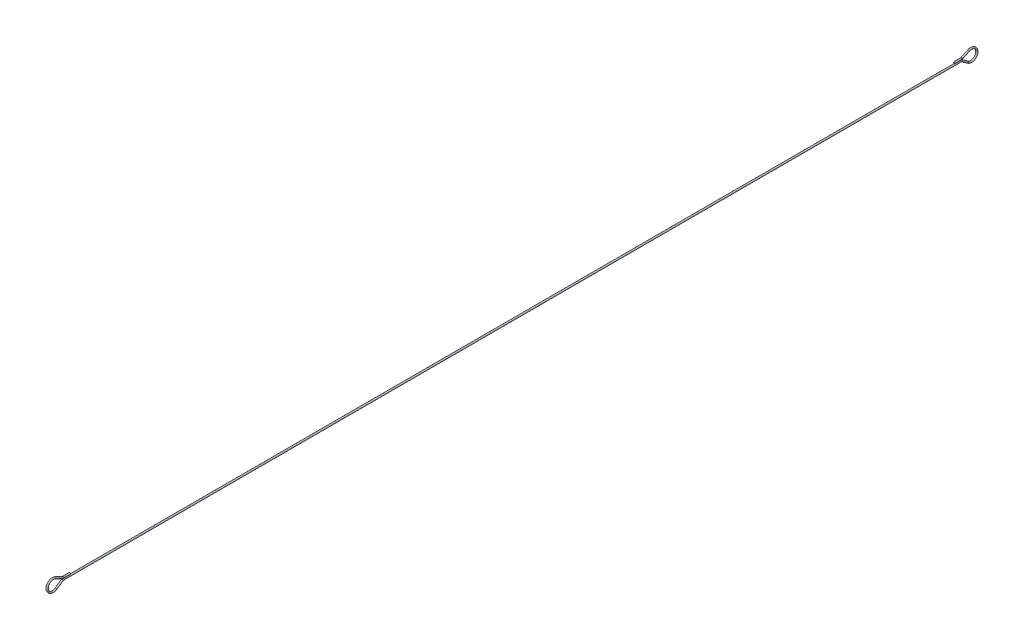
ISO-10303-21;
HEADER;
FILE_DESCRIPTION(('STEP AP214'),'2;1');
FILE_NAME('part.step','',(''),(''),'','','');
FILE_SCHEMA(('AUTOMOTIVE_DESIGN { 1 0 10303 214 1 1 1 1 }'));
ENDSEC;
DATA;
#1=APPLICATION_CONTEXT('core data for automotive mechanical design processes');
#2=APPLICATION_PROTOCOL_DEFINITION('international standard','automotive_design',2000,#1);
#3=PRODUCT_CONTEXT('',#1,'mechanical');
#4=PRODUCT('Part','Part','',(#3));
#5=PRODUCT_RELATED_PRODUCT_CATEGORY('part','',(#4));
#6=PRODUCT_DEFINITION_FORMATION('','',#4);
#7=PRODUCT_DEFINITION_CONTEXT('part definition',#1,'design');
#8=PRODUCT_DEFINITION('design','',#6,#7);
#9=PRODUCT_DEFINITION_SHAPE('','',#8);
#10=(LENGTH_UNIT() NAMED_UNIT(*) SI_UNIT(.MILLI.,.METRE.));
#11=(NAMED_UNIT(*) PLANE_ANGLE_UNIT() SI_UNIT($,.RADIAN.));
#12=(NAMED_UNIT(*) SI_UNIT($,.STERADIAN.) SOLID_ANGLE_UNIT());
#13=UNCERTAINTY_MEASURE_WITH_UNIT(LENGTH_MEASURE(1.E-05),#10,'distance_accuracy_value','');
#14=(GEOMETRIC_REPRESENTATION_CONTEXT(3) GLOBAL_UNCERTAINTY_ASSIGNED_CONTEXT((#13)) GLOBAL_UNIT_ASSIGNED_CONTEXT((#10,
#11,#12)) REPRESENTATION_CONTEXT('',''));
#15=CARTESIAN_POINT('',(0.,0.,0.));
#16=DIRECTION('',(0.,0.,1.));
#17=DIRECTION('',(1.,0.,0.));
#18=AXIS2_PLACEMENT_3D('',#15,#16,#17);
#19=CARTESIAN_POINT('',(0.,3.2,869.989079713668));
#20=DIRECTION('',(0.,0.,-1.));
#21=DIRECTION('',(1.,0.,0.));
#22=AXIS2_PLACEMENT_3D('',#19,#20,#21);
#23=PLANE('',#22);
#24=CARTESIAN_POINT('',(0.,3.2,869.989079713668));
#25=DIRECTION('',(0.,0.,-1.));
#26=DIRECTION('',(1.,0.,0.));
#27=AXIS2_PLACEMENT_3D('',#24,#25,#26);
#28=CIRCLE('',#27,1.5875);
#29=CARTESIAN_POINT('',(1.5875,3.2,869.989079713668));
#30=VERTEX_POINT('',#29);
#31=EDGE_CURVE('E10',#30,#30,#28,.T.);
#32=ORIENTED_EDGE('',*,*,#31,.T.);
#33=EDGE_LOOP('',(#32));
#34=FACE_BOUND('',#33,.T.);
#35=ADVANCED_FACE('F39',(#34),#23,.T.);
#36=CARTESIAN_POINT('',(0.,0.,0.));
#37=DIRECTION('',(0.,0.,1.));
#38=DIRECTION('',(0.,-1.,0.));
#39=AXIS2_PLACEMENT_3D('',#36,#37,#38);
#40=CYLINDRICAL_SURFACE('',#39,1.5875);
#41=CARTESIAN_POINT('',(0.,-1.44415729375069E-13,882.689079713668));
#42=DIRECTION('',(0.,0.,1.));
#43=DIRECTION('',(1.,0.,0.));
#44=AXIS2_PLACEMENT_3D('',#41,#42,#43);
#45=CIRCLE('',#44,1.5875);
#46=CARTESIAN_POINT('',(0.,1.58749999999987,882.689079713668));
#47=VERTEX_POINT('',#46);
#48=EDGE_CURVE('E70',#47,#47,#45,.T.);
#49=ORIENTED_EDGE('',*,*,#48,.F.);
#50=EDGE_LOOP('',(#49));
#51=FACE_BOUND('',#50,.T.);
#52=CARTESIAN_POINT('',(0.,-1.44415729375069E-13,-882.689079713668));
#53=DIRECTION('',(0.,0.,1.));
#54=DIRECTION('',(1.,0.,0.));
#55=AXIS2_PLACEMENT_3D('',#52,#53,#54);
#56=CIRCLE('',#55,1.5875);
#57=CARTESIAN_POINT('',(0.,1.58749999999987,-882.689079713668));
#58=VERTEX_POINT('',#57);
#59=EDGE_CURVE('E98',#58,#58,#56,.F.);
#60=ORIENTED_EDGE('',*,*,#59,.F.);
#61=EDGE_LOOP('',(#60));
#62=FACE_BOUND('',#61,.T.);
#63=ADVANCED_FACE('F105',(#51,#62),#40,.T.);
#64=CARTESIAN_POINT('',(0.,-3.17500000000003,882.689079713668));
#65=DIRECTION('',(1.,0.,0.));
#66=DIRECTION('',(0.,0.,-1.));
#67=AXIS2_PLACEMENT_3D('',#64,#65,#66);
#68=TOROIDAL_SURFACE('',#67,3.17499999999991,1.5875);
#69=CARTESIAN_POINT('',(0.,-0.567642289303452,884.500794583197));
#70=DIRECTION('',(0.,-0.57061885654441,0.821215026991074));
#71=DIRECTION('',(1.,0.,0.));
#72=AXIS2_PLACEMENT_3D('',#69,#70,#71);
#73=CIRCLE('',#72,1.5875);
#74=CARTESIAN_POINT('',(0.,0.736036566044864,885.406652017961));
#75=VERTEX_POINT('',#74);
#76=EDGE_CURVE('E66',#75,#75,#73,.T.);
#77=CARTESIAN_POINT('',(0.,-3.17500000000003,882.689079713668));
#78=DIRECTION('',(1.,0.,0.));
#79=DIRECTION('',(0.,0.,-1.));
#80=AXIS2_PLACEMENT_3D('',#77,#78,#79);
#81=CIRCLE('',#80,4.76249999999991);
#82=EDGE_CURVE('',#47,#75,#81,.T.);
#83=ORIENTED_EDGE('',*,*,#48,.T.);
#84=ORIENTED_EDGE('',*,*,#76,.F.);
#85=ORIENTED_EDGE('',*,*,#82,.T.);
#86=ORIENTED_EDGE('',*,*,#82,.F.);
#87=EDGE_LOOP('',(#83,#85,#84,#86));
#88=FACE_BOUND('',#87,.T.);
#89=ADVANCED_FACE('F107',(#88),#68,.T.);
#90=CARTESIAN_POINT('',(0.,-0.567642289303438,884.500794583197));
#91=DIRECTION('',(0.,-0.570618856544421,0.821215026991066));
#92=DIRECTION('',(0.,-0.821215026991067,-0.570618856544421));
#93=AXIS2_PLACEMENT_3D('',#90,#91,#92);
#94=CYLINDRICAL_SURFACE('',#93,1.5875);
#95=CARTESIAN_POINT('',(0.,-9.17594890499199,896.889573307686));
#96=DIRECTION('',(0.,-0.570618856544421,0.821215026991067));
#97=DIRECTION('',(1.,0.,0.));
#98=AXIS2_PLACEMENT_3D('',#95,#96,#97);
#99=CIRCLE('',#98,1.5875);
#100=CARTESIAN_POINT('',(0.,-10.4796277603403,895.983715872922));
#101=VERTEX_POINT('',#100);
#102=EDGE_CURVE('E62',#101,#101,#99,.T.);
#103=ORIENTED_EDGE('',*,*,#102,.F.);
#104=EDGE_LOOP('',(#103));
#105=FACE_BOUND('',#104,.T.);
#106=ORIENTED_EDGE('',*,*,#76,.T.);
#107=EDGE_LOOP('',(#106));
#108=FACE_BOUND('',#107,.T.);
#109=ADVANCED_FACE('F114',(#105,#108),#94,.T.);
#110=CARTESIAN_POINT('',(0.,0.,903.265454532195));
#111=DIRECTION('',(-1.,0.,0.));
#112=DIRECTION('',(0.,0.,1.));
#113=AXIS2_PLACEMENT_3D('',#110,#111,#112);
#114=TOROIDAL_SURFACE('',#113,11.1736251814736,1.5875);
#115=CARTESIAN_POINT('',(0.,10.1096495644325,898.506790288898));
#116=DIRECTION('',(0.,-0.425883647071573,-0.904777939141432));
#117=DIRECTION('',(1.,0.,0.));
#118=AXIS2_PLACEMENT_3D('',#115,#116,#117);
#119=CIRCLE('',#118,1.5875);
#120=CARTESIAN_POINT('',(0.,11.5459845428195,897.830699999172));
#121=VERTEX_POINT('',#120);
#122=EDGE_CURVE('E56',#121,#121,#119,.T.);
#123=CARTESIAN_POINT('',(0.,0.,903.265454532195));
#124=DIRECTION('',(-1.,0.,0.));
#125=DIRECTION('',(0.,0.,1.));
#126=AXIS2_PLACEMENT_3D('',#123,#124,#125);
#127=CIRCLE('',#126,12.7611251814736);
#128=EDGE_CURVE('',#101,#121,#127,.T.);
#129=ORIENTED_EDGE('',*,*,#102,.T.);
#130=ORIENTED_EDGE('',*,*,#122,.F.);
#131=ORIENTED_EDGE('',*,*,#128,.T.);
#132=ORIENTED_EDGE('',*,*,#128,.F.);
#133=EDGE_LOOP('',(#129,#131,#130,#132));
#134=FACE_BOUND('',#133,.T.);
#135=ADVANCED_FACE('F136',(#134),#114,.T.);
#136=CARTESIAN_POINT('',(0.,10.1096495644325,898.506790288898));
#137=DIRECTION('',(0.,-0.425883647071573,-0.904777939141432));
#138=DIRECTION('',(0.,0.904777939141432,-0.425883647071573));
#139=AXIS2_PLACEMENT_3D('',#136,#137,#138);
#140=CYLINDRICAL_SURFACE('',#139,1.5875);
#141=CARTESIAN_POINT('',(0.,3.68480577500471,884.857388713901));
#142=DIRECTION('',(0.,-0.425883647071573,-0.904777939141431));
#143=DIRECTION('',(1.,0.,0.));
#144=AXIS2_PLACEMENT_3D('',#141,#142,#143);
#145=CIRCLE('',#144,1.5875);
#146=CARTESIAN_POINT('',(0.,2.24847079661767,885.533479003627));
#147=VERTEX_POINT('',#146);
#148=EDGE_CURVE('E51',#147,#147,#145,.T.);
#149=ORIENTED_EDGE('',*,*,#148,.F.);
#150=EDGE_LOOP('',(#149));
#151=FACE_BOUND('',#150,.T.);
#152=ORIENTED_EDGE('',*,*,#122,.T.);
#153=EDGE_LOOP('',(#152));
#154=FACE_BOUND('',#153,.T.);
#155=ADVANCED_FACE('F130',(#151,#154),#140,.T.);
#156=CARTESIAN_POINT('',(0.,8.29131781683219,882.689079713668));
#157=DIRECTION('',(1.,0.,0.));
#158=DIRECTION('',(0.,0.,-1.));
#159=AXIS2_PLACEMENT_3D('',#156,#157,#158);
#160=TOROIDAL_SURFACE('',#159,5.09131781683217,1.5875);
#161=CARTESIAN_POINT('',(0.,3.20000000000002,882.689079713668));
#162=DIRECTION('',(0.,0.,-1.));
#163=DIRECTION('',(1.,0.,0.));
#164=AXIS2_PLACEMENT_3D('',#161,#162,#163);
#165=CIRCLE('',#164,1.5875);
#166=CARTESIAN_POINT('',(0.,1.61250000000002,882.689079713668));
#167=VERTEX_POINT('',#166);
#168=EDGE_CURVE('E46',#167,#167,#165,.T.);
#169=CARTESIAN_POINT('',(0.,8.29131781683219,882.689079713668));
#170=DIRECTION('',(1.,0.,0.));
#171=DIRECTION('',(0.,0.,-1.));
#172=AXIS2_PLACEMENT_3D('',#169,#170,#171);
#173=CIRCLE('',#172,6.67881781683217);
#174=EDGE_CURVE('',#147,#167,#173,.T.);
#175=ORIENTED_EDGE('',*,*,#148,.T.);
#176=ORIENTED_EDGE('',*,*,#168,.F.);
#177=ORIENTED_EDGE('',*,*,#174,.T.);
#178=ORIENTED_EDGE('',*,*,#174,.F.);
#179=EDGE_LOOP('',(#175,#177,#176,#178));
#180=FACE_BOUND('',#179,.T.);
#181=ADVANCED_FACE('F123',(#180),#160,.T.);
#182=CARTESIAN_POINT('',(0.,3.2,882.689079713668));
#183=DIRECTION('',(0.,0.,-1.));
#184=DIRECTION('',(-1.,0.,0.));
#185=AXIS2_PLACEMENT_3D('',#182,#183,#184);
#186=CYLINDRICAL_SURFACE('',#185,1.5875);
#187=ORIENTED_EDGE('',*,*,#31,.F.);
#188=EDGE_LOOP('',(#187));
#189=FACE_BOUND('',#188,.T.);
#190=ORIENTED_EDGE('',*,*,#168,.T.);
#191=EDGE_LOOP('',(#190));
#192=FACE_BOUND('',#191,.T.);
#193=ADVANCED_FACE('F120',(#189,#192),#186,.T.);
#194=CARTESIAN_POINT('',(0.,3.2,-869.989079713668));
#195=DIRECTION('',(0.,0.,1.));
#196=DIRECTION('',(1.,0.,0.));
#197=AXIS2_PLACEMENT_3D('',#194,#195,#196);
#198=PLANE('',#197);
#199=CARTESIAN_POINT('',(0.,3.2,-869.989079713668));
#200=DIRECTION('',(0.,0.,-1.));
#201=DIRECTION('',(1.,0.,0.));
#202=AXIS2_PLACEMENT_3D('',#199,#200,#201);
#203=CIRCLE('',#202,1.5875);
#204=CARTESIAN_POINT('',(1.5875,3.2,-869.989079713668));
#205=VERTEX_POINT('',#204);
#206=EDGE_CURVE('E74',#205,#205,#203,.F.);
#207=ORIENTED_EDGE('',*,*,#206,.T.);
#208=EDGE_LOOP('',(#207));
#209=FACE_BOUND('',#208,.T.);
#210=ADVANCED_FACE('F122',(#209),#198,.T.);
#211=CARTESIAN_POINT('',(0.,-3.17500000000003,-882.689079713668));
#212=DIRECTION('',(-1.,0.,0.));
#213=DIRECTION('',(0.,0.,1.));
#214=AXIS2_PLACEMENT_3D('',#211,#212,#213);
#215=TOROIDAL_SURFACE('',#214,3.17499999999991,1.5875);
#216=CARTESIAN_POINT('',(0.,-0.567642289303452,-884.500794583197));
#217=DIRECTION('',(0.,0.57061885654441,0.821215026991074));
#218=DIRECTION('',(1.,0.,0.));
#219=AXIS2_PLACEMENT_3D('',#216,#217,#218);
#220=CIRCLE('',#219,1.5875);
#221=CARTESIAN_POINT('',(0.,0.736036566044864,-885.406652017961));
#222=VERTEX_POINT('',#221);
#223=EDGE_CURVE('E94',#222,#222,#220,.F.);
#224=CARTESIAN_POINT('',(0.,-3.17500000000003,-882.689079713668));
#225=DIRECTION('',(-1.,0.,0.));
#226=DIRECTION('',(0.,0.,1.));
#227=AXIS2_PLACEMENT_3D('',#224,#225,#226);
#228=CIRCLE('',#227,4.76249999999991);
#229=EDGE_CURVE('',#58,#222,#228,.T.);
#230=ORIENTED_EDGE('',*,*,#59,.T.);
#231=ORIENTED_EDGE('',*,*,#223,.F.);
#232=ORIENTED_EDGE('',*,*,#229,.T.);
#233=ORIENTED_EDGE('',*,*,#229,.F.);
#234=EDGE_LOOP('',(#230,#232,#231,#233));
#235=FACE_BOUND('',#234,.T.);
#236=ADVANCED_FACE('F103',(#235),#215,.T.);
#237=CARTESIAN_POINT('',(0.,-0.567642289303438,-884.500794583197));
#238=DIRECTION('',(0.,-0.570618856544421,-0.821215026991066));
#239=DIRECTION('',(0.,0.821215026991067,-0.570618856544421));
#240=AXIS2_PLACEMENT_3D('',#237,#238,#239);
#241=CYLINDRICAL_SURFACE('',#240,1.5875);
#242=CARTESIAN_POINT('',(0.,-9.17594890499199,-896.889573307686));
#243=DIRECTION('',(0.,0.570618856544421,0.821215026991067));
#244=DIRECTION('',(1.,0.,0.));
#245=AXIS2_PLACEMENT_3D('',#242,#243,#244);
#246=CIRCLE('',#245,1.5875);
#247=CARTESIAN_POINT('',(0.,-10.4796277603403,-895.983715872922));
#248=VERTEX_POINT('',#247);
#249=EDGE_CURVE('E90',#248,#248,#246,.F.);
#250=ORIENTED_EDGE('',*,*,#249,.F.);
#251=EDGE_LOOP('',(#250));
#252=FACE_BOUND('',#251,.T.);
#253=ORIENTED_EDGE('',*,*,#223,.T.);
#254=EDGE_LOOP('',(#253));
#255=FACE_BOUND('',#254,.T.);
#256=ADVANCED_FACE('F188',(#252,#255),#241,.T.);
#257=CARTESIAN_POINT('',(0.,0.,-903.265454532195));
#258=DIRECTION('',(1.,0.,0.));
#259=DIRECTION('',(0.,0.,-1.));
#260=AXIS2_PLACEMENT_3D('',#257,#258,#259);
#261=TOROIDAL_SURFACE('',#260,11.1736251814736,1.5875);
#262=CARTESIAN_POINT('',(0.,10.1096495644325,-898.506790288898));
#263=DIRECTION('',(0.,0.425883647071573,-0.904777939141432));
#264=DIRECTION('',(1.,0.,0.));
#265=AXIS2_PLACEMENT_3D('',#262,#263,#264);
#266=CIRCLE('',#265,1.5875);
#267=CARTESIAN_POINT('',(0.,11.5459845428195,-897.830699999172));
#268=VERTEX_POINT('',#267);
#269=EDGE_CURVE('E86',#268,#268,#266,.F.);
#270=CARTESIAN_POINT('',(0.,0.,-903.265454532195));
#271=DIRECTION('',(1.,0.,0.));
#272=DIRECTION('',(0.,0.,-1.));
#273=AXIS2_PLACEMENT_3D('',#270,#271,#272);
#274=CIRCLE('',#273,12.7611251814736);
#275=EDGE_CURVE('',#248,#268,#274,.T.);
#276=ORIENTED_EDGE('',*,*,#249,.T.);
#277=ORIENTED_EDGE('',*,*,#269,.F.);
#278=ORIENTED_EDGE('',*,*,#275,.T.);
#279=ORIENTED_EDGE('',*,*,#275,.F.);
#280=EDGE_LOOP('',(#276,#278,#277,#279));
#281=FACE_BOUND('',#280,.T.);
#282=ADVANCED_FACE('F198',(#281),#261,.T.);
#283=CARTESIAN_POINT('',(0.,10.1096495644325,-898.506790288898));
#284=DIRECTION('',(0.,-0.425883647071573,0.904777939141432));
#285=DIRECTION('',(0.,-0.904777939141432,-0.425883647071573));
#286=AXIS2_PLACEMENT_3D('',#283,#284,#285);
#287=CYLINDRICAL_SURFACE('',#286,1.5875);
#288=CARTESIAN_POINT('',(0.,3.68480577500471,-884.857388713901));
#289=DIRECTION('',(0.,0.425883647071573,-0.904777939141431));
#290=DIRECTION('',(1.,0.,0.));
#291=AXIS2_PLACEMENT_3D('',#288,#289,#290);
#292=CIRCLE('',#291,1.5875);
#293=CARTESIAN_POINT('',(0.,2.24847079661767,-885.533479003627));
#294=VERTEX_POINT('',#293);
#295=EDGE_CURVE('E82',#294,#294,#292,.F.);
#296=ORIENTED_EDGE('',*,*,#295,.F.);
#297=EDGE_LOOP('',(#296));
#298=FACE_BOUND('',#297,.T.);
#299=ORIENTED_EDGE('',*,*,#269,.T.);
#300=EDGE_LOOP('',(#299));
#301=FACE_BOUND('',#300,.T.);
#302=ADVANCED_FACE('F209',(#298,#301),#287,.T.);
#303=CARTESIAN_POINT('',(0.,8.29131781683219,-882.689079713668));
#304=DIRECTION('',(-1.,0.,0.));
#305=DIRECTION('',(0.,0.,1.));
#306=AXIS2_PLACEMENT_3D('',#303,#304,#305);
#307=TOROIDAL_SURFACE('',#306,5.09131781683217,1.5875);
#308=CARTESIAN_POINT('',(0.,3.20000000000002,-882.689079713668));
#309=DIRECTION('',(0.,0.,-1.));
#310=DIRECTION('',(1.,0.,0.));
#311=AXIS2_PLACEMENT_3D('',#308,#309,#310);
#312=CIRCLE('',#311,1.5875);
#313=CARTESIAN_POINT('',(0.,1.61250000000002,-882.689079713668));
#314=VERTEX_POINT('',#313);
#315=EDGE_CURVE('E78',#314,#314,#312,.F.);
#316=CARTESIAN_POINT('',(0.,8.29131781683219,-882.689079713668));
#317=DIRECTION('',(-1.,0.,0.));
#318=DIRECTION('',(0.,0.,1.));
#319=AXIS2_PLACEMENT_3D('',#316,#317,#318);
#320=CIRCLE('',#319,6.67881781683217);
#321=EDGE_CURVE('',#294,#314,#320,.T.);
#322=ORIENTED_EDGE('',*,*,#295,.T.);
#323=ORIENTED_EDGE('',*,*,#315,.F.);
#324=ORIENTED_EDGE('',*,*,#321,.T.);
#325=ORIENTED_EDGE('',*,*,#321,.F.);
#326=EDGE_LOOP('',(#322,#324,#323,#325));
#327=FACE_BOUND('',#326,.T.);
#328=ADVANCED_FACE('F218',(#327),#307,.T.);
#329=CARTESIAN_POINT('',(0.,3.2,-882.689079713668));
#330=DIRECTION('',(0.,0.,1.));
#331=DIRECTION('',(1.,0.,0.));
#332=AXIS2_PLACEMENT_3D('',#329,#330,#331);
#333=CYLINDRICAL_SURFACE('',#332,1.5875);
#334=ORIENTED_EDGE('',*,*,#206,.F.);
#335=EDGE_LOOP('',(#334));
#336=FACE_BOUND('',#335,.T.);
#337=ORIENTED_EDGE('',*,*,#315,.T.);
#338=EDGE_LOOP('',(#337));
#339=FACE_BOUND('',#338,.T.);
#340=ADVANCED_FACE('F117',(#336,#339),#333,.T.);
#341=CLOSED_SHELL('',(#35,#63,#89,#109,#135,#155,#181,#193,#210,#236,#256,#282,#302,#328,#340));
#342=MANIFOLD_SOLID_BREP('B2',#341);
#343=ADVANCED_BREP_SHAPE_REPRESENTATION('',(#18,#342),#14);
#344=SHAPE_DEFINITION_REPRESENTATION(#9,#343);
ENDSEC;
END-ISO-10303-21;
